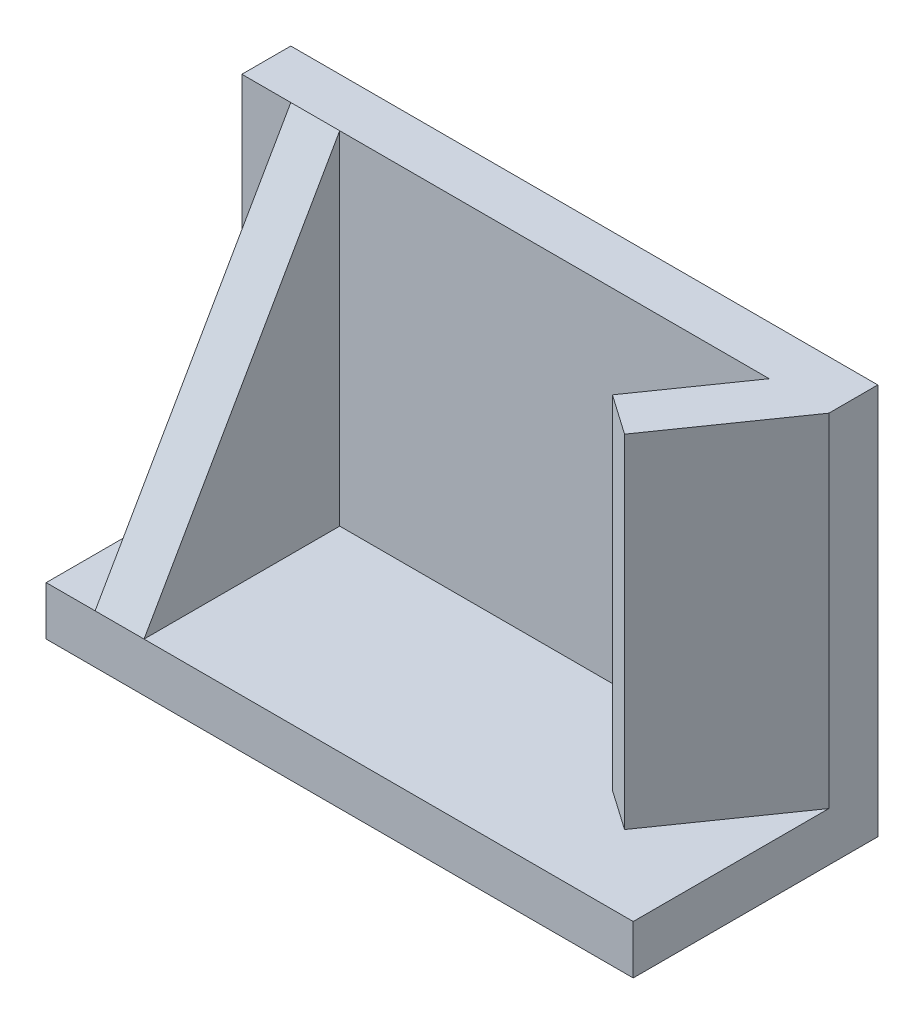
ISO-10303-21;
HEADER;
FILE_DESCRIPTION(('STEP AP214'),'2;1');
FILE_NAME('part.step','',(''),(''),'','','');
FILE_SCHEMA(('AUTOMOTIVE_DESIGN { 1 0 10303 214 1 1 1 1 }'));
ENDSEC;
DATA;
#1=APPLICATION_CONTEXT('core data for automotive mechanical design processes');
#2=APPLICATION_PROTOCOL_DEFINITION('international standard','automotive_design',2000,#1);
#3=PRODUCT_CONTEXT('',#1,'mechanical');
#4=PRODUCT('Part','Part','',(#3));
#5=PRODUCT_RELATED_PRODUCT_CATEGORY('part','',(#4));
#6=PRODUCT_DEFINITION_FORMATION('','',#4);
#7=PRODUCT_DEFINITION_CONTEXT('part definition',#1,'design');
#8=PRODUCT_DEFINITION('design','',#6,#7);
#9=PRODUCT_DEFINITION_SHAPE('','',#8);
#10=(LENGTH_UNIT() NAMED_UNIT(*) SI_UNIT(.MILLI.,.METRE.));
#11=(NAMED_UNIT(*) PLANE_ANGLE_UNIT() SI_UNIT($,.RADIAN.));
#12=(NAMED_UNIT(*) SI_UNIT($,.STERADIAN.) SOLID_ANGLE_UNIT());
#13=UNCERTAINTY_MEASURE_WITH_UNIT(LENGTH_MEASURE(1.E-05),#10,'distance_accuracy_value','');
#14=(GEOMETRIC_REPRESENTATION_CONTEXT(3) GLOBAL_UNCERTAINTY_ASSIGNED_CONTEXT((#13)) GLOBAL_UNIT_ASSIGNED_CONTEXT((#10,
#11,#12)) REPRESENTATION_CONTEXT('',''));
#15=CARTESIAN_POINT('',(0.,0.,0.));
#16=DIRECTION('',(0.,0.,1.));
#17=DIRECTION('',(1.,0.,0.));
#18=AXIS2_PLACEMENT_3D('',#15,#16,#17);
#19=CARTESIAN_POINT('',(120.,0.,0.));
#20=DIRECTION('',(0.,0.,-1.));
#21=DIRECTION('',(0.,1.,0.));
#22=AXIS2_PLACEMENT_3D('',#19,#20,#21);
#23=PLANE('',#22);
#24=DIRECTION('',(0.,1.,0.));
#25=VECTOR('',#24,1.);
#26=CARTESIAN_POINT('',(10.,70.,0.));
#27=LINE('',#26,#25);
#28=CARTESIAN_POINT('',(9.99999999999999,0.,0.));
#29=VERTEX_POINT('',#28);
#30=CARTESIAN_POINT('',(9.99999999999999,70.,0.));
#31=VERTEX_POINT('',#30);
#32=EDGE_CURVE('E55',#29,#31,#27,.T.);
#33=ORIENTED_EDGE('',*,*,#32,.T.);
#34=DIRECTION('',(-1.,0.,0.));
#35=VECTOR('',#34,1.);
#36=CARTESIAN_POINT('',(120.,70.,0.));
#37=LINE('',#36,#35);
#38=CARTESIAN_POINT('',(0.,70.,0.));
#39=VERTEX_POINT('',#38);
#40=EDGE_CURVE('E249',#31,#39,#37,.T.);
#41=ORIENTED_EDGE('',*,*,#40,.T.);
#42=DIRECTION('',(0.,-1.,0.));
#43=VECTOR('',#42,1.);
#44=CARTESIAN_POINT('',(0.,0.,0.));
#45=LINE('',#44,#43);
#46=CARTESIAN_POINT('',(0.,0.,0.));
#47=VERTEX_POINT('',#46);
#48=EDGE_CURVE('E237',#39,#47,#45,.T.);
#49=ORIENTED_EDGE('',*,*,#48,.T.);
#50=DIRECTION('',(-1.,0.,0.));
#51=VECTOR('',#50,1.);
#52=CARTESIAN_POINT('',(120.,0.,0.));
#53=LINE('',#52,#51);
#54=EDGE_CURVE('E244',#29,#47,#53,.T.);
#55=ORIENTED_EDGE('',*,*,#54,.F.);
#56=EDGE_LOOP('',(#33,#41,#49,#55));
#57=FACE_BOUND('',#56,.T.);
#58=ADVANCED_FACE('F39',(#57),#23,.F.);
#59=CARTESIAN_POINT('',(120.,0.,40.));
#60=DIRECTION('',(0.,-1.,0.));
#61=DIRECTION('',(0.,0.,-1.));
#62=AXIS2_PLACEMENT_3D('',#59,#60,#61);
#63=PLANE('',#62);
#64=DIRECTION('',(0.,0.,-1.));
#65=VECTOR('',#64,1.);
#66=CARTESIAN_POINT('',(10.,0.,0.));
#67=LINE('',#66,#65);
#68=CARTESIAN_POINT('',(10.,0.,40.));
#69=VERTEX_POINT('',#68);
#70=EDGE_CURVE('E149',#69,#29,#67,.T.);
#71=ORIENTED_EDGE('',*,*,#70,.T.);
#72=ORIENTED_EDGE('',*,*,#54,.T.);
#73=DIRECTION('',(0.,0.,1.));
#74=VECTOR('',#73,1.);
#75=CARTESIAN_POINT('',(0.,0.,40.));
#76=LINE('',#75,#74);
#77=CARTESIAN_POINT('',(0.,0.,40.));
#78=VERTEX_POINT('',#77);
#79=EDGE_CURVE('E151',#47,#78,#76,.T.);
#80=ORIENTED_EDGE('',*,*,#79,.T.);
#81=DIRECTION('',(-1.,0.,0.));
#82=VECTOR('',#81,1.);
#83=CARTESIAN_POINT('',(120.,0.,40.));
#84=LINE('',#83,#82);
#85=EDGE_CURVE('E134',#69,#78,#84,.T.);
#86=ORIENTED_EDGE('',*,*,#85,.F.);
#87=EDGE_LOOP('',(#71,#72,#80,#86));
#88=FACE_BOUND('',#87,.T.);
#89=ADVANCED_FACE('F148',(#88),#63,.F.);
#90=CARTESIAN_POINT('',(120.,-10.,40.));
#91=DIRECTION('',(0.,0.,-1.));
#92=DIRECTION('',(-1.,0.,0.));
#93=AXIS2_PLACEMENT_3D('',#90,#91,#92);
#94=PLANE('',#93);
#95=DIRECTION('',(0.,-1.,0.));
#96=VECTOR('',#95,1.);
#97=CARTESIAN_POINT('',(0.,-10.,40.));
#98=LINE('',#97,#96);
#99=CARTESIAN_POINT('',(0.,-10.,40.));
#100=VERTEX_POINT('',#99);
#101=EDGE_CURVE('E187',#78,#100,#98,.T.);
#102=ORIENTED_EDGE('',*,*,#101,.T.);
#103=DIRECTION('',(-1.,0.,0.));
#104=VECTOR('',#103,1.);
#105=CARTESIAN_POINT('',(120.,-10.,40.));
#106=LINE('',#105,#104);
#107=CARTESIAN_POINT('',(120.,-10.,40.));
#108=VERTEX_POINT('',#107);
#109=EDGE_CURVE('E11',#108,#100,#106,.T.);
#110=ORIENTED_EDGE('',*,*,#109,.F.);
#111=DIRECTION('',(0.,-1.,0.));
#112=VECTOR('',#111,1.);
#113=CARTESIAN_POINT('',(120.,-10.,40.));
#114=LINE('',#113,#112);
#115=CARTESIAN_POINT('',(120.,0.,40.));
#116=VERTEX_POINT('',#115);
#117=EDGE_CURVE('E205',#116,#108,#114,.T.);
#118=ORIENTED_EDGE('',*,*,#117,.F.);
#119=CARTESIAN_POINT('',(20.,0.,40.));
#120=VERTEX_POINT('',#119);
#121=EDGE_CURVE('E138',#116,#120,#84,.T.);
#122=ORIENTED_EDGE('',*,*,#121,.T.);
#123=DIRECTION('',(-1.,0.,0.));
#124=VECTOR('',#123,1.);
#125=CARTESIAN_POINT('',(20.,0.,40.));
#126=LINE('',#125,#124);
#127=EDGE_CURVE('E131',#120,#69,#126,.T.);
#128=ORIENTED_EDGE('',*,*,#127,.T.);
#129=ORIENTED_EDGE('',*,*,#85,.T.);
#130=EDGE_LOOP('',(#102,#110,#118,#122,#128,#129));
#131=FACE_BOUND('',#130,.T.);
#132=ADVANCED_FACE('F41',(#131),#94,.F.);
#133=CARTESIAN_POINT('',(120.,-9.99999999999999,-10.));
#134=DIRECTION('',(0.,1.,0.));
#135=DIRECTION('',(0.,0.,1.));
#136=AXIS2_PLACEMENT_3D('',#133,#134,#135);
#137=PLANE('',#136);
#138=DIRECTION('',(0.,0.,-1.));
#139=VECTOR('',#138,1.);
#140=CARTESIAN_POINT('',(0.,-9.99999999999999,-10.));
#141=LINE('',#140,#139);
#142=CARTESIAN_POINT('',(0.,-9.99999999999999,-10.));
#143=VERTEX_POINT('',#142);
#144=EDGE_CURVE('E227',#100,#143,#141,.T.);
#145=ORIENTED_EDGE('',*,*,#144,.T.);
#146=DIRECTION('',(-1.,0.,0.));
#147=VECTOR('',#146,1.);
#148=CARTESIAN_POINT('',(120.,-9.99999999999999,-10.));
#149=LINE('',#148,#147);
#150=CARTESIAN_POINT('',(120.,-9.99999999999999,-10.));
#151=VERTEX_POINT('',#150);
#152=EDGE_CURVE('E48',#151,#143,#149,.T.);
#153=ORIENTED_EDGE('',*,*,#152,.F.);
#154=DIRECTION('',(0.,0.,-1.));
#155=VECTOR('',#154,1.);
#156=CARTESIAN_POINT('',(120.,-9.99999999999999,-10.));
#157=LINE('',#156,#155);
#158=EDGE_CURVE('E209',#108,#151,#157,.T.);
#159=ORIENTED_EDGE('',*,*,#158,.F.);
#160=ORIENTED_EDGE('',*,*,#109,.T.);
#161=EDGE_LOOP('',(#145,#153,#159,#160));
#162=FACE_BOUND('',#161,.T.);
#163=ADVANCED_FACE('F276',(#162),#137,.F.);
#164=CARTESIAN_POINT('',(120.,70.,-10.));
#165=DIRECTION('',(0.,0.,1.));
#166=DIRECTION('',(0.,-1.,0.));
#167=AXIS2_PLACEMENT_3D('',#164,#165,#166);
#168=PLANE('',#167);
#169=DIRECTION('',(0.,1.,0.));
#170=VECTOR('',#169,1.);
#171=CARTESIAN_POINT('',(0.,70.,-10.));
#172=LINE('',#171,#170);
#173=CARTESIAN_POINT('',(0.,70.,-10.));
#174=VERTEX_POINT('',#173);
#175=EDGE_CURVE('E230',#143,#174,#172,.T.);
#176=ORIENTED_EDGE('',*,*,#175,.T.);
#177=DIRECTION('',(-1.,0.,0.));
#178=VECTOR('',#177,1.);
#179=CARTESIAN_POINT('',(120.,70.,-10.));
#180=LINE('',#179,#178);
#181=CARTESIAN_POINT('',(120.,70.,-10.));
#182=VERTEX_POINT('',#181);
#183=EDGE_CURVE('E253',#182,#174,#180,.T.);
#184=ORIENTED_EDGE('',*,*,#183,.F.);
#185=DIRECTION('',(0.,1.,0.));
#186=VECTOR('',#185,1.);
#187=CARTESIAN_POINT('',(120.,70.,-10.));
#188=LINE('',#187,#186);
#189=EDGE_CURVE('E212',#151,#182,#188,.T.);
#190=ORIENTED_EDGE('',*,*,#189,.F.);
#191=ORIENTED_EDGE('',*,*,#152,.T.);
#192=EDGE_LOOP('',(#176,#184,#190,#191));
#193=FACE_BOUND('',#192,.T.);
#194=ADVANCED_FACE('F262',(#193),#168,.F.);
#195=CARTESIAN_POINT('',(120.,70.,0.));
#196=DIRECTION('',(0.,-1.,0.));
#197=DIRECTION('',(0.,0.,-1.));
#198=AXIS2_PLACEMENT_3D('',#195,#196,#197);
#199=PLANE('',#198);
#200=DIRECTION('',(0.,0.,1.));
#201=VECTOR('',#200,1.);
#202=CARTESIAN_POINT('',(0.,70.,0.));
#203=LINE('',#202,#201);
#204=EDGE_CURVE('E233',#174,#39,#203,.T.);
#205=ORIENTED_EDGE('',*,*,#204,.T.);
#206=ORIENTED_EDGE('',*,*,#40,.F.);
#207=DIRECTION('',(-1.,0.,0.));
#208=VECTOR('',#207,1.);
#209=CARTESIAN_POINT('',(20.,70.,0.));
#210=LINE('',#209,#208);
#211=CARTESIAN_POINT('',(20.,70.,0.));
#212=VERTEX_POINT('',#211);
#213=EDGE_CURVE('E62',#212,#31,#210,.T.);
#214=ORIENTED_EDGE('',*,*,#213,.F.);
#215=CARTESIAN_POINT('',(107.806755398223,70.,0.));
#216=VERTEX_POINT('',#215);
#217=EDGE_CURVE('E250',#216,#212,#37,.T.);
#218=ORIENTED_EDGE('',*,*,#217,.F.);
#219=DIRECTION('',(-0.572182602063735,0.,0.820126252412136));
#220=VECTOR('',#219,1.);
#221=CARTESIAN_POINT('',(94.6332594139666,70.,18.8819615517267));
#222=LINE('',#221,#220);
#223=CARTESIAN_POINT('',(94.6332594139666,70.,18.8819615517267));
#224=VERTEX_POINT('',#223);
#225=EDGE_CURVE('E192',#216,#224,#222,.T.);
#226=ORIENTED_EDGE('',*,*,#225,.T.);
#227=DIRECTION('',(0.820126252412135,0.,0.572182602063735));
#228=VECTOR('',#227,1.);
#229=CARTESIAN_POINT('',(102.834521938088,70.,24.6037875723641));
#230=LINE('',#229,#228);
#231=CARTESIAN_POINT('',(102.834521938088,70.,24.6037875723641));
#232=VERTEX_POINT('',#231);
#233=EDGE_CURVE('E188',#224,#232,#230,.T.);
#234=ORIENTED_EDGE('',*,*,#233,.T.);
#235=DIRECTION('',(0.572182602063734,0.,-0.820126252412136));
#236=VECTOR('',#235,1.);
#237=CARTESIAN_POINT('',(120.,70.,0.));
#238=LINE('',#237,#236);
#239=CARTESIAN_POINT('',(120.,70.,0.));
#240=VERTEX_POINT('',#239);
#241=EDGE_CURVE('E183',#232,#240,#238,.T.);
#242=ORIENTED_EDGE('',*,*,#241,.T.);
#243=DIRECTION('',(0.,0.,1.));
#244=VECTOR('',#243,1.);
#245=CARTESIAN_POINT('',(120.,70.,0.));
#246=LINE('',#245,#244);
#247=EDGE_CURVE('E215',#182,#240,#246,.T.);
#248=ORIENTED_EDGE('',*,*,#247,.F.);
#249=ORIENTED_EDGE('',*,*,#183,.T.);
#250=EDGE_LOOP('',(#205,#206,#214,#218,#226,#234,#242,#248,#249));
#251=FACE_BOUND('',#250,.T.);
#252=ADVANCED_FACE('F269',(#251),#199,.F.);
#253=ORIENTED_EDGE('',*,*,#217,.T.);
#254=DIRECTION('',(0.,1.,0.));
#255=VECTOR('',#254,1.);
#256=CARTESIAN_POINT('',(20.,70.,0.));
#257=LINE('',#256,#255);
#258=CARTESIAN_POINT('',(20.,0.,0.));
#259=VERTEX_POINT('',#258);
#260=EDGE_CURVE('E166',#259,#212,#257,.T.);
#261=ORIENTED_EDGE('',*,*,#260,.F.);
#262=CARTESIAN_POINT('',(107.806755398223,0.,0.));
#263=VERTEX_POINT('',#262);
#264=EDGE_CURVE('E245',#263,#259,#53,.T.);
#265=ORIENTED_EDGE('',*,*,#264,.F.);
#266=DIRECTION('',(0.,1.,0.));
#267=VECTOR('',#266,1.);
#268=CARTESIAN_POINT('',(107.806755398223,-10.002,0.));
#269=LINE('',#268,#267);
#270=EDGE_CURVE('E182',#263,#216,#269,.T.);
#271=ORIENTED_EDGE('',*,*,#270,.T.);
#272=EDGE_LOOP('',(#253,#261,#265,#271));
#273=FACE_BOUND('',#272,.T.);
#274=ADVANCED_FACE('F285',(#273),#23,.F.);
#275=ORIENTED_EDGE('',*,*,#264,.T.);
#276=DIRECTION('',(0.,0.,-1.));
#277=VECTOR('',#276,1.);
#278=CARTESIAN_POINT('',(20.,0.,0.));
#279=LINE('',#278,#277);
#280=EDGE_CURVE('E304',#120,#259,#279,.T.);
#281=ORIENTED_EDGE('',*,*,#280,.F.);
#282=ORIENTED_EDGE('',*,*,#121,.F.);
#283=DIRECTION('',(0.,0.,1.));
#284=VECTOR('',#283,1.);
#285=CARTESIAN_POINT('',(120.,0.,40.));
#286=LINE('',#285,#284);
#287=CARTESIAN_POINT('',(120.,0.,0.));
#288=VERTEX_POINT('',#287);
#289=EDGE_CURVE('E154',#288,#116,#286,.T.);
#290=ORIENTED_EDGE('',*,*,#289,.F.);
#291=DIRECTION('',(0.572182602063734,0.,-0.820126252412136));
#292=VECTOR('',#291,1.);
#293=CARTESIAN_POINT('',(120.,0.,0.));
#294=LINE('',#293,#292);
#295=CARTESIAN_POINT('',(102.834521938088,0.,24.6037875723641));
#296=VERTEX_POINT('',#295);
#297=EDGE_CURVE('E179',#296,#288,#294,.T.);
#298=ORIENTED_EDGE('',*,*,#297,.F.);
#299=DIRECTION('',(0.820126252412135,0.,0.572182602063735));
#300=VECTOR('',#299,1.);
#301=CARTESIAN_POINT('',(102.834521938088,0.,24.6037875723641));
#302=LINE('',#301,#300);
#303=CARTESIAN_POINT('',(94.6332594139666,0.,18.8819615517267));
#304=VERTEX_POINT('',#303);
#305=EDGE_CURVE('E176',#304,#296,#302,.T.);
#306=ORIENTED_EDGE('',*,*,#305,.F.);
#307=DIRECTION('',(-0.572182602063735,0.,0.820126252412136));
#308=VECTOR('',#307,1.);
#309=CARTESIAN_POINT('',(94.6332594139666,0.,18.8819615517267));
#310=LINE('',#309,#308);
#311=EDGE_CURVE('E144',#263,#304,#310,.T.);
#312=ORIENTED_EDGE('',*,*,#311,.F.);
#313=EDGE_LOOP('',(#275,#281,#282,#290,#298,#306,#312));
#314=FACE_BOUND('',#313,.T.);
#315=ADVANCED_FACE('F290',(#314),#63,.F.);
#316=CARTESIAN_POINT('',(120.,0.,0.));
#317=DIRECTION('',(-1.,0.,0.));
#318=DIRECTION('',(0.,0.,1.));
#319=AXIS2_PLACEMENT_3D('',#316,#317,#318);
#320=PLANE('',#319);
#321=ORIENTED_EDGE('',*,*,#117,.T.);
#322=ORIENTED_EDGE('',*,*,#158,.T.);
#323=ORIENTED_EDGE('',*,*,#189,.T.);
#324=ORIENTED_EDGE('',*,*,#247,.T.);
#325=DIRECTION('',(0.,-1.,0.));
#326=VECTOR('',#325,1.);
#327=CARTESIAN_POINT('',(120.,0.,0.));
#328=LINE('',#327,#326);
#329=EDGE_CURVE('E219',#240,#288,#328,.T.);
#330=ORIENTED_EDGE('',*,*,#329,.T.);
#331=ORIENTED_EDGE('',*,*,#289,.T.);
#332=EDGE_LOOP('',(#321,#322,#323,#324,#330,#331));
#333=FACE_BOUND('',#332,.T.);
#334=ADVANCED_FACE('F273',(#333),#320,.F.);
#335=CARTESIAN_POINT('',(0.,0.,0.));
#336=DIRECTION('',(-1.,0.,0.));
#337=DIRECTION('',(0.,0.,1.));
#338=AXIS2_PLACEMENT_3D('',#335,#336,#337);
#339=PLANE('',#338);
#340=ORIENTED_EDGE('',*,*,#101,.F.);
#341=ORIENTED_EDGE('',*,*,#79,.F.);
#342=ORIENTED_EDGE('',*,*,#48,.F.);
#343=ORIENTED_EDGE('',*,*,#204,.F.);
#344=ORIENTED_EDGE('',*,*,#175,.F.);
#345=ORIENTED_EDGE('',*,*,#144,.F.);
#346=EDGE_LOOP('',(#340,#341,#342,#343,#344,#345));
#347=FACE_BOUND('',#346,.T.);
#348=ADVANCED_FACE('F267',(#347),#339,.T.);
#349=CARTESIAN_POINT('',(120.,-10.002,0.));
#350=DIRECTION('',(0.820126252412136,0.,0.572182602063734));
#351=DIRECTION('',(0.572182602063734,0.,-0.820126252412136));
#352=AXIS2_PLACEMENT_3D('',#349,#350,#351);
#353=PLANE('',#352);
#354=DIRECTION('',(0.,1.,0.));
#355=VECTOR('',#354,1.);
#356=CARTESIAN_POINT('',(102.834521938088,-10.002,24.6037875723641));
#357=LINE('',#356,#355);
#358=EDGE_CURVE('E196',#296,#232,#357,.T.);
#359=ORIENTED_EDGE('',*,*,#358,.F.);
#360=ORIENTED_EDGE('',*,*,#297,.T.);
#361=ORIENTED_EDGE('',*,*,#329,.F.);
#362=ORIENTED_EDGE('',*,*,#241,.F.);
#363=EDGE_LOOP('',(#359,#360,#361,#362));
#364=FACE_BOUND('',#363,.T.);
#365=ADVANCED_FACE('F322',(#364),#353,.T.);
#366=CARTESIAN_POINT('',(102.834521938088,-10.002,24.6037875723641));
#367=DIRECTION('',(-0.572182602063735,0.,0.820126252412135));
#368=DIRECTION('',(0.820126252412135,0.,0.572182602063735));
#369=AXIS2_PLACEMENT_3D('',#366,#367,#368);
#370=PLANE('',#369);
#371=DIRECTION('',(0.,1.,0.));
#372=VECTOR('',#371,1.);
#373=CARTESIAN_POINT('',(94.6332594139666,-10.002,18.8819615517267));
#374=LINE('',#373,#372);
#375=EDGE_CURVE('E200',#304,#224,#374,.T.);
#376=ORIENTED_EDGE('',*,*,#375,.F.);
#377=ORIENTED_EDGE('',*,*,#305,.T.);
#378=ORIENTED_EDGE('',*,*,#358,.T.);
#379=ORIENTED_EDGE('',*,*,#233,.F.);
#380=EDGE_LOOP('',(#376,#377,#378,#379));
#381=FACE_BOUND('',#380,.T.);
#382=ADVANCED_FACE('F319',(#381),#370,.T.);
#383=CARTESIAN_POINT('',(94.6332594139666,-10.002,18.8819615517267));
#384=DIRECTION('',(-0.820126252412136,0.,-0.572182602063735));
#385=DIRECTION('',(-0.572182602063735,0.,0.820126252412136));
#386=AXIS2_PLACEMENT_3D('',#383,#384,#385);
#387=PLANE('',#386);
#388=ORIENTED_EDGE('',*,*,#270,.F.);
#389=ORIENTED_EDGE('',*,*,#311,.T.);
#390=ORIENTED_EDGE('',*,*,#375,.T.);
#391=ORIENTED_EDGE('',*,*,#225,.F.);
#392=EDGE_LOOP('',(#388,#389,#390,#391));
#393=FACE_BOUND('',#392,.T.);
#394=ADVANCED_FACE('F316',(#393),#387,.T.);
#395=CARTESIAN_POINT('',(20.,0.,40.));
#396=DIRECTION('',(0.,-0.496138938356834,-0.868243142124459));
#397=DIRECTION('',(0.,0.868243142124459,-0.496138938356834));
#398=AXIS2_PLACEMENT_3D('',#395,#396,#397);
#399=PLANE('',#398);
#400=DIRECTION('',(0.,-0.868243142124459,0.496138938356834));
#401=VECTOR('',#400,1.);
#402=CARTESIAN_POINT('',(10.,0.,40.));
#403=LINE('',#402,#401);
#404=EDGE_CURVE('E159',#31,#69,#403,.T.);
#405=ORIENTED_EDGE('',*,*,#404,.T.);
#406=ORIENTED_EDGE('',*,*,#127,.F.);
#407=DIRECTION('',(0.,-0.868243142124459,0.496138938356834));
#408=VECTOR('',#407,1.);
#409=CARTESIAN_POINT('',(20.,0.,40.));
#410=LINE('',#409,#408);
#411=EDGE_CURVE('E171',#212,#120,#410,.T.);
#412=ORIENTED_EDGE('',*,*,#411,.F.);
#413=ORIENTED_EDGE('',*,*,#213,.T.);
#414=EDGE_LOOP('',(#405,#406,#412,#413));
#415=FACE_BOUND('',#414,.T.);
#416=ADVANCED_FACE('F162',(#415),#399,.F.);
#417=CARTESIAN_POINT('',(20.,0.,0.));
#418=DIRECTION('',(1.,0.,0.));
#419=DIRECTION('',(0.,0.,-1.));
#420=AXIS2_PLACEMENT_3D('',#417,#418,#419);
#421=PLANE('',#420);
#422=ORIENTED_EDGE('',*,*,#411,.T.);
#423=ORIENTED_EDGE('',*,*,#280,.T.);
#424=ORIENTED_EDGE('',*,*,#260,.T.);
#425=EDGE_LOOP('',(#422,#423,#424));
#426=FACE_BOUND('',#425,.T.);
#427=ADVANCED_FACE('F303',(#426),#421,.T.);
#428=CARTESIAN_POINT('',(10.,0.,0.));
#429=DIRECTION('',(1.,0.,0.));
#430=DIRECTION('',(0.,0.,-1.));
#431=AXIS2_PLACEMENT_3D('',#428,#429,#430);
#432=PLANE('',#431);
#433=ORIENTED_EDGE('',*,*,#404,.F.);
#434=ORIENTED_EDGE('',*,*,#32,.F.);
#435=ORIENTED_EDGE('',*,*,#70,.F.);
#436=EDGE_LOOP('',(#433,#434,#435));
#437=FACE_BOUND('',#436,.T.);
#438=ADVANCED_FACE('F158',(#437),#432,.F.);
#439=CLOSED_SHELL('',(#58,#89,#132,#163,#194,#252,#274,#315,#334,#348,#365,#382,#394,#416,#427,#438));
#440=MANIFOLD_SOLID_BREP('B2',#439);
#441=ADVANCED_BREP_SHAPE_REPRESENTATION('',(#18,#440),#14);
#442=SHAPE_DEFINITION_REPRESENTATION(#9,#441);
ENDSEC;
END-ISO-10303-21;
